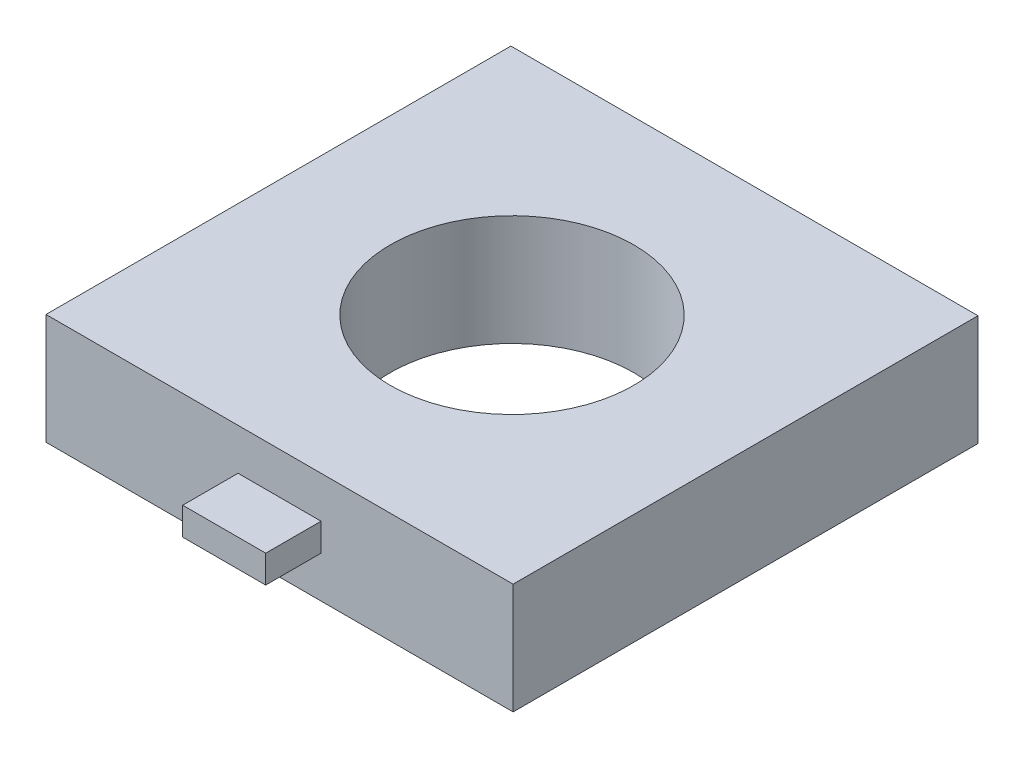
ISO-10303-21;
HEADER;
FILE_DESCRIPTION(('STEP AP214'),'2;1');
FILE_NAME('part.step','',(''),(''),'','','');
FILE_SCHEMA(('AUTOMOTIVE_DESIGN { 1 0 10303 214 1 1 1 1 }'));
ENDSEC;
DATA;
#1=APPLICATION_CONTEXT('core data for automotive mechanical design processes');
#2=APPLICATION_PROTOCOL_DEFINITION('international standard','automotive_design',2000,#1);
#3=PRODUCT_CONTEXT('',#1,'mechanical');
#4=PRODUCT('Part','Part','',(#3));
#5=PRODUCT_RELATED_PRODUCT_CATEGORY('part','',(#4));
#6=PRODUCT_DEFINITION_FORMATION('','',#4);
#7=PRODUCT_DEFINITION_CONTEXT('part definition',#1,'design');
#8=PRODUCT_DEFINITION('design','',#6,#7);
#9=PRODUCT_DEFINITION_SHAPE('','',#8);
#10=(LENGTH_UNIT() NAMED_UNIT(*) SI_UNIT(.MILLI.,.METRE.));
#11=(NAMED_UNIT(*) PLANE_ANGLE_UNIT() SI_UNIT($,.RADIAN.));
#12=(NAMED_UNIT(*) SI_UNIT($,.STERADIAN.) SOLID_ANGLE_UNIT());
#13=UNCERTAINTY_MEASURE_WITH_UNIT(LENGTH_MEASURE(1.E-05),#10,'distance_accuracy_value','');
#14=(GEOMETRIC_REPRESENTATION_CONTEXT(3) GLOBAL_UNCERTAINTY_ASSIGNED_CONTEXT((#13)) GLOBAL_UNIT_ASSIGNED_CONTEXT((#10,
#11,#12)) REPRESENTATION_CONTEXT('',''));
#15=CARTESIAN_POINT('',(0.,0.,0.));
#16=DIRECTION('',(0.,0.,1.));
#17=DIRECTION('',(1.,0.,0.));
#18=AXIS2_PLACEMENT_3D('',#15,#16,#17);
#19=CARTESIAN_POINT('',(0.,0.,42.));
#20=DIRECTION('',(0.,0.,-1.));
#21=DIRECTION('',(-1.,0.,0.));
#22=AXIS2_PLACEMENT_3D('',#19,#20,#21);
#23=PLANE('',#22);
#24=DIRECTION('',(0.,-1.,0.));
#25=VECTOR('',#24,1.);
#26=CARTESIAN_POINT('',(0.,-10.,42.));
#27=LINE('',#26,#25);
#28=CARTESIAN_POINT('',(0.,0.,42.));
#29=VERTEX_POINT('',#28);
#30=CARTESIAN_POINT('',(0.,-10.,42.));
#31=VERTEX_POINT('',#30);
#32=EDGE_CURVE('E145',#29,#31,#27,.T.);
#33=ORIENTED_EDGE('',*,*,#32,.T.);
#34=DIRECTION('',(1.,0.,0.));
#35=VECTOR('',#34,1.);
#36=CARTESIAN_POINT('',(42.2,-10.,42.));
#37=LINE('',#36,#35);
#38=CARTESIAN_POINT('',(42.2,-10.,42.));
#39=VERTEX_POINT('',#38);
#40=EDGE_CURVE('E149',#31,#39,#37,.T.);
#41=ORIENTED_EDGE('',*,*,#40,.T.);
#42=DIRECTION('',(0.,1.,0.));
#43=VECTOR('',#42,1.);
#44=CARTESIAN_POINT('',(42.2,0.,42.));
#45=LINE('',#44,#43);
#46=CARTESIAN_POINT('',(42.2,0.,42.));
#47=VERTEX_POINT('',#46);
#48=EDGE_CURVE('E153',#39,#47,#45,.T.);
#49=ORIENTED_EDGE('',*,*,#48,.T.);
#50=DIRECTION('',(-1.,0.,0.));
#51=VECTOR('',#50,1.);
#52=CARTESIAN_POINT('',(0.,0.,42.));
#53=LINE('',#52,#51);
#54=EDGE_CURVE('E156',#47,#29,#53,.T.);
#55=ORIENTED_EDGE('',*,*,#54,.T.);
#56=EDGE_LOOP('',(#33,#41,#49,#55));
#57=FACE_BOUND('',#56,.T.);
#58=DIRECTION('',(0.,-1.,0.));
#59=VECTOR('',#58,1.);
#60=CARTESIAN_POINT('',(17.35,-6.25,42.));
#61=LINE('',#60,#59);
#62=CARTESIAN_POINT('',(17.35,-3.75,42.));
#63=VERTEX_POINT('',#62);
#64=CARTESIAN_POINT('',(17.35,-6.25,42.));
#65=VERTEX_POINT('',#64);
#66=EDGE_CURVE('E61',#63,#65,#61,.T.);
#67=ORIENTED_EDGE('',*,*,#66,.F.);
#68=DIRECTION('',(-1.,0.,0.));
#69=VECTOR('',#68,1.);
#70=CARTESIAN_POINT('',(17.35,-3.75,42.));
#71=LINE('',#70,#69);
#72=CARTESIAN_POINT('',(24.85,-3.75,42.));
#73=VERTEX_POINT('',#72);
#74=EDGE_CURVE('E65',#73,#63,#71,.T.);
#75=ORIENTED_EDGE('',*,*,#74,.F.);
#76=DIRECTION('',(0.,1.,0.));
#77=VECTOR('',#76,1.);
#78=CARTESIAN_POINT('',(24.85,-6.25,42.));
#79=LINE('',#78,#77);
#80=CARTESIAN_POINT('',(24.85,-6.25,42.));
#81=VERTEX_POINT('',#80);
#82=EDGE_CURVE('E239',#81,#73,#79,.T.);
#83=ORIENTED_EDGE('',*,*,#82,.F.);
#84=DIRECTION('',(1.,0.,0.));
#85=VECTOR('',#84,1.);
#86=CARTESIAN_POINT('',(17.35,-6.25,42.));
#87=LINE('',#86,#85);
#88=EDGE_CURVE('E236',#65,#81,#87,.T.);
#89=ORIENTED_EDGE('',*,*,#88,.F.);
#90=EDGE_LOOP('',(#67,#75,#83,#89));
#91=FACE_BOUND('',#90,.T.);
#92=ADVANCED_FACE('F45',(#57,#91),#23,.F.);
#93=CARTESIAN_POINT('',(0.,-10.,42.));
#94=DIRECTION('',(1.,0.,0.));
#95=DIRECTION('',(0.,0.,-1.));
#96=AXIS2_PLACEMENT_3D('',#93,#94,#95);
#97=PLANE('',#96);
#98=DIRECTION('',(0.,-1.,0.));
#99=VECTOR('',#98,1.);
#100=CARTESIAN_POINT('',(0.,-10.,0.));
#101=LINE('',#100,#99);
#102=CARTESIAN_POINT('',(0.,0.,0.));
#103=VERTEX_POINT('',#102);
#104=CARTESIAN_POINT('',(0.,-10.,0.));
#105=VERTEX_POINT('',#104);
#106=EDGE_CURVE('E134',#103,#105,#101,.T.);
#107=ORIENTED_EDGE('',*,*,#106,.T.);
#108=DIRECTION('',(0.,0.,-1.));
#109=VECTOR('',#108,1.);
#110=CARTESIAN_POINT('',(0.,-10.,42.));
#111=LINE('',#110,#109);
#112=EDGE_CURVE('E11',#31,#105,#111,.T.);
#113=ORIENTED_EDGE('',*,*,#112,.F.);
#114=ORIENTED_EDGE('',*,*,#32,.F.);
#115=DIRECTION('',(0.,0.,-1.));
#116=VECTOR('',#115,1.);
#117=CARTESIAN_POINT('',(0.,0.,42.));
#118=LINE('',#117,#116);
#119=EDGE_CURVE('E158',#29,#103,#118,.T.);
#120=ORIENTED_EDGE('',*,*,#119,.T.);
#121=EDGE_LOOP('',(#107,#113,#114,#120));
#122=FACE_BOUND('',#121,.T.);
#123=ADVANCED_FACE('F47',(#122),#97,.F.);
#124=CARTESIAN_POINT('',(42.2,-10.,42.));
#125=DIRECTION('',(0.,1.,0.));
#126=DIRECTION('',(0.,0.,1.));
#127=AXIS2_PLACEMENT_3D('',#124,#125,#126);
#128=PLANE('',#127);
#129=CARTESIAN_POINT('',(21.1,-10.,21.));
#130=DIRECTION('',(0.,1.,0.));
#131=DIRECTION('',(0.,0.,1.));
#132=AXIS2_PLACEMENT_3D('',#129,#130,#131);
#133=CIRCLE('',#132,11.);
#134=CARTESIAN_POINT('',(21.1,-10.,32.));
#135=VERTEX_POINT('',#134);
#136=EDGE_CURVE('E224',#135,#135,#133,.T.);
#137=ORIENTED_EDGE('',*,*,#136,.T.);
#138=EDGE_LOOP('',(#137));
#139=FACE_BOUND('',#138,.T.);
#140=DIRECTION('',(1.,0.,0.));
#141=VECTOR('',#140,1.);
#142=CARTESIAN_POINT('',(42.2,-10.,0.));
#143=LINE('',#142,#141);
#144=CARTESIAN_POINT('',(42.2,-10.,0.));
#145=VERTEX_POINT('',#144);
#146=EDGE_CURVE('E139',#105,#145,#143,.T.);
#147=ORIENTED_EDGE('',*,*,#146,.T.);
#148=DIRECTION('',(0.,0.,-1.));
#149=VECTOR('',#148,1.);
#150=CARTESIAN_POINT('',(42.2,-10.,42.));
#151=LINE('',#150,#149);
#152=EDGE_CURVE('E54',#39,#145,#151,.T.);
#153=ORIENTED_EDGE('',*,*,#152,.F.);
#154=ORIENTED_EDGE('',*,*,#40,.F.);
#155=ORIENTED_EDGE('',*,*,#112,.T.);
#156=EDGE_LOOP('',(#147,#153,#154,#155));
#157=FACE_BOUND('',#156,.T.);
#158=ADVANCED_FACE('F194',(#139,#157),#128,.F.);
#159=CARTESIAN_POINT('',(42.2,0.,42.));
#160=DIRECTION('',(-1.,0.,0.));
#161=DIRECTION('',(0.,0.,1.));
#162=AXIS2_PLACEMENT_3D('',#159,#160,#161);
#163=PLANE('',#162);
#164=DIRECTION('',(0.,1.,0.));
#165=VECTOR('',#164,1.);
#166=CARTESIAN_POINT('',(42.2,0.,0.));
#167=LINE('',#166,#165);
#168=CARTESIAN_POINT('',(42.2,0.,0.));
#169=VERTEX_POINT('',#168);
#170=EDGE_CURVE('E162',#145,#169,#167,.T.);
#171=ORIENTED_EDGE('',*,*,#170,.T.);
#172=DIRECTION('',(0.,0.,-1.));
#173=VECTOR('',#172,1.);
#174=CARTESIAN_POINT('',(42.2,0.,42.));
#175=LINE('',#174,#173);
#176=EDGE_CURVE('E170',#47,#169,#175,.T.);
#177=ORIENTED_EDGE('',*,*,#176,.F.);
#178=ORIENTED_EDGE('',*,*,#48,.F.);
#179=ORIENTED_EDGE('',*,*,#152,.T.);
#180=EDGE_LOOP('',(#171,#177,#178,#179));
#181=FACE_BOUND('',#180,.T.);
#182=ADVANCED_FACE('F179',(#181),#163,.F.);
#183=CARTESIAN_POINT('',(0.,0.,42.));
#184=DIRECTION('',(0.,-1.,0.));
#185=DIRECTION('',(0.,0.,-1.));
#186=AXIS2_PLACEMENT_3D('',#183,#184,#185);
#187=PLANE('',#186);
#188=CARTESIAN_POINT('',(21.1,0.,21.));
#189=DIRECTION('',(0.,1.,0.));
#190=DIRECTION('',(0.,0.,1.));
#191=AXIS2_PLACEMENT_3D('',#188,#189,#190);
#192=CIRCLE('',#191,11.);
#193=CARTESIAN_POINT('',(21.1,0.,32.));
#194=VERTEX_POINT('',#193);
#195=EDGE_CURVE('E221',#194,#194,#192,.T.);
#196=ORIENTED_EDGE('',*,*,#195,.F.);
#197=EDGE_LOOP('',(#196));
#198=FACE_BOUND('',#197,.T.);
#199=DIRECTION('',(-1.,0.,0.));
#200=VECTOR('',#199,1.);
#201=CARTESIAN_POINT('',(0.,0.,0.));
#202=LINE('',#201,#200);
#203=EDGE_CURVE('E150',#169,#103,#202,.T.);
#204=ORIENTED_EDGE('',*,*,#203,.T.);
#205=ORIENTED_EDGE('',*,*,#119,.F.);
#206=ORIENTED_EDGE('',*,*,#54,.F.);
#207=ORIENTED_EDGE('',*,*,#176,.T.);
#208=EDGE_LOOP('',(#204,#205,#206,#207));
#209=FACE_BOUND('',#208,.T.);
#210=ADVANCED_FACE('F188',(#198,#209),#187,.F.);
#211=CARTESIAN_POINT('',(0.,0.,0.));
#212=DIRECTION('',(0.,0.,-1.));
#213=DIRECTION('',(-1.,0.,0.));
#214=AXIS2_PLACEMENT_3D('',#211,#212,#213);
#215=PLANE('',#214);
#216=ORIENTED_EDGE('',*,*,#106,.F.);
#217=ORIENTED_EDGE('',*,*,#203,.F.);
#218=ORIENTED_EDGE('',*,*,#170,.F.);
#219=ORIENTED_EDGE('',*,*,#146,.F.);
#220=EDGE_LOOP('',(#216,#217,#218,#219));
#221=FACE_BOUND('',#220,.T.);
#222=ADVANCED_FACE('F185',(#221),#215,.T.);
#223=CARTESIAN_POINT('',(17.35,-6.25,47.));
#224=DIRECTION('',(1.,0.,0.));
#225=DIRECTION('',(0.,0.,-1.));
#226=AXIS2_PLACEMENT_3D('',#223,#224,#225);
#227=PLANE('',#226);
#228=ORIENTED_EDGE('',*,*,#66,.T.);
#229=DIRECTION('',(0.,0.,-1.));
#230=VECTOR('',#229,1.);
#231=CARTESIAN_POINT('',(17.35,-6.25,47.));
#232=LINE('',#231,#230);
#233=CARTESIAN_POINT('',(17.35,-6.25,47.));
#234=VERTEX_POINT('',#233);
#235=EDGE_CURVE('E114',#234,#65,#232,.T.);
#236=ORIENTED_EDGE('',*,*,#235,.F.);
#237=DIRECTION('',(0.,-1.,0.));
#238=VECTOR('',#237,1.);
#239=CARTESIAN_POINT('',(17.35,-6.25,47.));
#240=LINE('',#239,#238);
#241=CARTESIAN_POINT('',(17.35,-3.75,47.));
#242=VERTEX_POINT('',#241);
#243=EDGE_CURVE('E121',#242,#234,#240,.T.);
#244=ORIENTED_EDGE('',*,*,#243,.F.);
#245=DIRECTION('',(0.,0.,-1.));
#246=VECTOR('',#245,1.);
#247=CARTESIAN_POINT('',(17.35,-3.75,47.));
#248=LINE('',#247,#246);
#249=EDGE_CURVE('E233',#242,#63,#248,.T.);
#250=ORIENTED_EDGE('',*,*,#249,.T.);
#251=EDGE_LOOP('',(#228,#236,#244,#250));
#252=FACE_BOUND('',#251,.T.);
#253=ADVANCED_FACE('F132',(#252),#227,.F.);
#254=CARTESIAN_POINT('',(17.35,-6.25,47.));
#255=DIRECTION('',(0.,1.,0.));
#256=DIRECTION('',(0.,0.,1.));
#257=AXIS2_PLACEMENT_3D('',#254,#255,#256);
#258=PLANE('',#257);
#259=ORIENTED_EDGE('',*,*,#88,.T.);
#260=DIRECTION('',(0.,0.,-1.));
#261=VECTOR('',#260,1.);
#262=CARTESIAN_POINT('',(24.85,-6.25,47.));
#263=LINE('',#262,#261);
#264=CARTESIAN_POINT('',(24.85,-6.25,47.));
#265=VERTEX_POINT('',#264);
#266=EDGE_CURVE('E116',#265,#81,#263,.T.);
#267=ORIENTED_EDGE('',*,*,#266,.F.);
#268=DIRECTION('',(1.,0.,0.));
#269=VECTOR('',#268,1.);
#270=CARTESIAN_POINT('',(17.35,-6.25,47.));
#271=LINE('',#270,#269);
#272=EDGE_CURVE('E109',#234,#265,#271,.T.);
#273=ORIENTED_EDGE('',*,*,#272,.F.);
#274=ORIENTED_EDGE('',*,*,#235,.T.);
#275=EDGE_LOOP('',(#259,#267,#273,#274));
#276=FACE_BOUND('',#275,.T.);
#277=ADVANCED_FACE('F112',(#276),#258,.F.);
#278=CARTESIAN_POINT('',(24.85,-6.25,47.));
#279=DIRECTION('',(-1.,0.,0.));
#280=DIRECTION('',(0.,0.,1.));
#281=AXIS2_PLACEMENT_3D('',#278,#279,#280);
#282=PLANE('',#281);
#283=ORIENTED_EDGE('',*,*,#82,.T.);
#284=DIRECTION('',(0.,0.,-1.));
#285=VECTOR('',#284,1.);
#286=CARTESIAN_POINT('',(24.85,-3.75,47.));
#287=LINE('',#286,#285);
#288=CARTESIAN_POINT('',(24.85,-3.75,47.));
#289=VERTEX_POINT('',#288);
#290=EDGE_CURVE('E141',#289,#73,#287,.T.);
#291=ORIENTED_EDGE('',*,*,#290,.F.);
#292=DIRECTION('',(0.,1.,0.));
#293=VECTOR('',#292,1.);
#294=CARTESIAN_POINT('',(24.85,-6.25,47.));
#295=LINE('',#294,#293);
#296=EDGE_CURVE('E120',#265,#289,#295,.T.);
#297=ORIENTED_EDGE('',*,*,#296,.F.);
#298=ORIENTED_EDGE('',*,*,#266,.T.);
#299=EDGE_LOOP('',(#283,#291,#297,#298));
#300=FACE_BOUND('',#299,.T.);
#301=ADVANCED_FACE('F251',(#300),#282,.F.);
#302=CARTESIAN_POINT('',(17.35,-3.75,47.));
#303=DIRECTION('',(0.,-1.,0.));
#304=DIRECTION('',(0.,0.,-1.));
#305=AXIS2_PLACEMENT_3D('',#302,#303,#304);
#306=PLANE('',#305);
#307=ORIENTED_EDGE('',*,*,#74,.T.);
#308=ORIENTED_EDGE('',*,*,#249,.F.);
#309=DIRECTION('',(-1.,0.,0.));
#310=VECTOR('',#309,1.);
#311=CARTESIAN_POINT('',(17.35,-3.75,47.));
#312=LINE('',#311,#310);
#313=EDGE_CURVE('E126',#289,#242,#312,.T.);
#314=ORIENTED_EDGE('',*,*,#313,.F.);
#315=ORIENTED_EDGE('',*,*,#290,.T.);
#316=EDGE_LOOP('',(#307,#308,#314,#315));
#317=FACE_BOUND('',#316,.T.);
#318=ADVANCED_FACE('F249',(#317),#306,.F.);
#319=CARTESIAN_POINT('',(0.,0.,47.));
#320=DIRECTION('',(0.,0.,-1.));
#321=DIRECTION('',(-1.,0.,0.));
#322=AXIS2_PLACEMENT_3D('',#319,#320,#321);
#323=PLANE('',#322);
#324=ORIENTED_EDGE('',*,*,#243,.T.);
#325=ORIENTED_EDGE('',*,*,#272,.T.);
#326=ORIENTED_EDGE('',*,*,#296,.T.);
#327=ORIENTED_EDGE('',*,*,#313,.T.);
#328=EDGE_LOOP('',(#324,#325,#326,#327));
#329=FACE_BOUND('',#328,.T.);
#330=ADVANCED_FACE('F124',(#329),#323,.F.);
#331=CARTESIAN_POINT('',(21.1,-25.,21.));
#332=DIRECTION('',(0.,1.,0.));
#333=DIRECTION('',(0.,0.,1.));
#334=AXIS2_PLACEMENT_3D('',#331,#332,#333);
#335=CYLINDRICAL_SURFACE('',#334,11.);
#336=ORIENTED_EDGE('',*,*,#195,.T.);
#337=EDGE_LOOP('',(#336));
#338=FACE_BOUND('',#337,.T.);
#339=ORIENTED_EDGE('',*,*,#136,.F.);
#340=EDGE_LOOP('',(#339));
#341=FACE_BOUND('',#340,.T.);
#342=ADVANCED_FACE('F261',(#338,#341),#335,.F.);
#343=CLOSED_SHELL('',(#92,#123,#158,#182,#210,#222,#253,#277,#301,#318,#330,#342));
#344=MANIFOLD_SOLID_BREP('B2',#343);
#345=ADVANCED_BREP_SHAPE_REPRESENTATION('',(#18,#344),#14);
#346=SHAPE_DEFINITION_REPRESENTATION(#9,#345);
ENDSEC;
END-ISO-10303-21;
